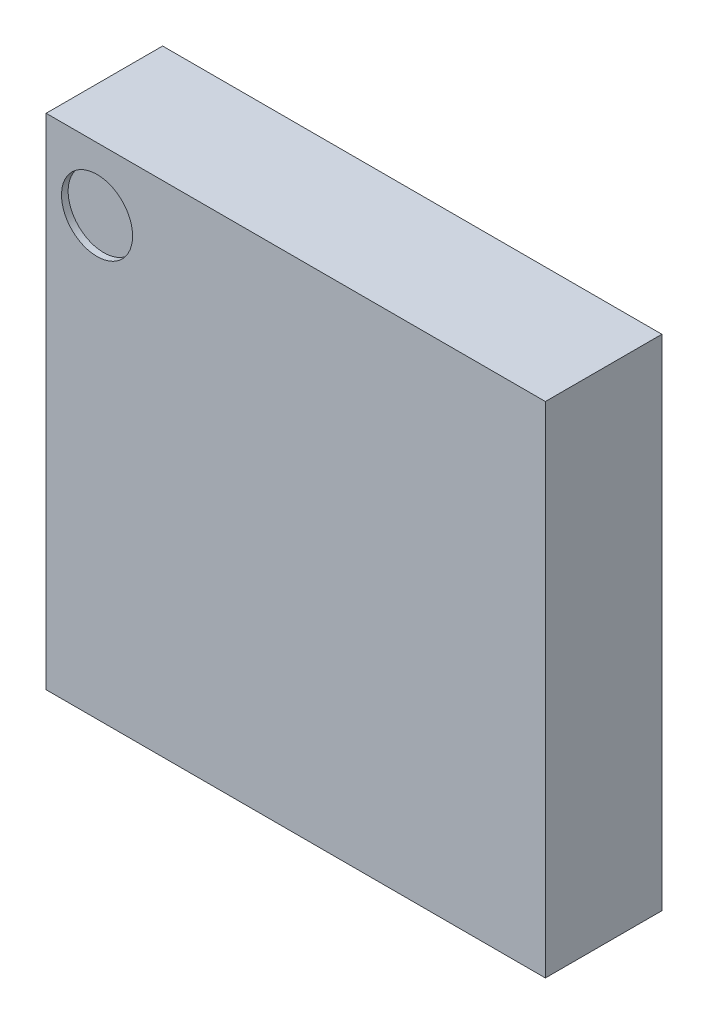
ISO-10303-21;
HEADER;
FILE_DESCRIPTION(('STEP AP214'),'2;1');
FILE_NAME('part.step','',(''),(''),'','','');
FILE_SCHEMA(('AUTOMOTIVE_DESIGN { 1 0 10303 214 1 1 1 1 }'));
ENDSEC;
DATA;
#1=APPLICATION_CONTEXT('core data for automotive mechanical design processes');
#2=APPLICATION_PROTOCOL_DEFINITION('international standard','automotive_design',2000,#1);
#3=PRODUCT_CONTEXT('',#1,'mechanical');
#4=PRODUCT('Part','Part','',(#3));
#5=PRODUCT_RELATED_PRODUCT_CATEGORY('part','',(#4));
#6=PRODUCT_DEFINITION_FORMATION('','',#4);
#7=PRODUCT_DEFINITION_CONTEXT('part definition',#1,'design');
#8=PRODUCT_DEFINITION('design','',#6,#7);
#9=PRODUCT_DEFINITION_SHAPE('','',#8);
#10=(LENGTH_UNIT() NAMED_UNIT(*) SI_UNIT(.MILLI.,.METRE.));
#11=(NAMED_UNIT(*) PLANE_ANGLE_UNIT() SI_UNIT($,.RADIAN.));
#12=(NAMED_UNIT(*) SI_UNIT($,.STERADIAN.) SOLID_ANGLE_UNIT());
#13=UNCERTAINTY_MEASURE_WITH_UNIT(LENGTH_MEASURE(1.E-05),#10,'distance_accuracy_value','');
#14=(GEOMETRIC_REPRESENTATION_CONTEXT(3) GLOBAL_UNCERTAINTY_ASSIGNED_CONTEXT((#13)) GLOBAL_UNIT_ASSIGNED_CONTEXT((#10,
#11,#12)) REPRESENTATION_CONTEXT('',''));
#15=CARTESIAN_POINT('',(0.,0.,0.));
#16=DIRECTION('',(0.,0.,1.));
#17=DIRECTION('',(1.,0.,0.));
#18=AXIS2_PLACEMENT_3D('',#15,#16,#17);
#19=CARTESIAN_POINT('',(-0.75,-0.75,0.45));
#20=DIRECTION('',(0.,1.,0.));
#21=DIRECTION('',(0.,0.,1.));
#22=AXIS2_PLACEMENT_3D('',#19,#20,#21);
#23=PLANE('',#22);
#24=DIRECTION('',(1.,0.,0.));
#25=VECTOR('',#24,1.);
#26=CARTESIAN_POINT('',(-0.75,-0.75,0.1));
#27=LINE('',#26,#25);
#28=CARTESIAN_POINT('',(-0.75,-0.75,0.1));
#29=VERTEX_POINT('',#28);
#30=CARTESIAN_POINT('',(0.749999999999999,-0.75,0.1));
#31=VERTEX_POINT('',#30);
#32=EDGE_CURVE('E110',#29,#31,#27,.T.);
#33=ORIENTED_EDGE('',*,*,#32,.T.);
#34=DIRECTION('',(0.,0.,-1.));
#35=VECTOR('',#34,1.);
#36=CARTESIAN_POINT('',(0.749999999999999,-0.75,0.45));
#37=LINE('',#36,#35);
#38=CARTESIAN_POINT('',(0.749999999999999,-0.75,0.45));
#39=VERTEX_POINT('',#38);
#40=EDGE_CURVE('E11',#39,#31,#37,.T.);
#41=ORIENTED_EDGE('',*,*,#40,.F.);
#42=DIRECTION('',(1.,0.,0.));
#43=VECTOR('',#42,1.);
#44=CARTESIAN_POINT('',(-0.75,-0.75,0.45));
#45=LINE('',#44,#43);
#46=CARTESIAN_POINT('',(-0.75,-0.75,0.45));
#47=VERTEX_POINT('',#46);
#48=EDGE_CURVE('E91',#47,#39,#45,.T.);
#49=ORIENTED_EDGE('',*,*,#48,.F.);
#50=DIRECTION('',(0.,0.,-1.));
#51=VECTOR('',#50,1.);
#52=CARTESIAN_POINT('',(-0.75,-0.75,0.45));
#53=LINE('',#52,#51);
#54=EDGE_CURVE('E58',#47,#29,#53,.T.);
#55=ORIENTED_EDGE('',*,*,#54,.T.);
#56=EDGE_LOOP('',(#33,#41,#49,#55));
#57=FACE_BOUND('',#56,.T.);
#58=ADVANCED_FACE('F39',(#57),#23,.F.);
#59=CARTESIAN_POINT('',(0.749999999999999,-0.75,0.45));
#60=DIRECTION('',(-1.,0.,0.));
#61=DIRECTION('',(0.,0.,1.));
#62=AXIS2_PLACEMENT_3D('',#59,#60,#61);
#63=PLANE('',#62);
#64=DIRECTION('',(0.,1.,0.));
#65=VECTOR('',#64,1.);
#66=CARTESIAN_POINT('',(0.749999999999999,-0.75,0.1));
#67=LINE('',#66,#65);
#68=CARTESIAN_POINT('',(0.749999999999999,0.75,0.1));
#69=VERTEX_POINT('',#68);
#70=EDGE_CURVE('E97',#31,#69,#67,.T.);
#71=ORIENTED_EDGE('',*,*,#70,.T.);
#72=DIRECTION('',(0.,0.,-1.));
#73=VECTOR('',#72,1.);
#74=CARTESIAN_POINT('',(0.749999999999999,0.75,0.45));
#75=LINE('',#74,#73);
#76=CARTESIAN_POINT('',(0.749999999999999,0.75,0.45));
#77=VERTEX_POINT('',#76);
#78=EDGE_CURVE('E49',#77,#69,#75,.T.);
#79=ORIENTED_EDGE('',*,*,#78,.F.);
#80=DIRECTION('',(0.,1.,0.));
#81=VECTOR('',#80,1.);
#82=CARTESIAN_POINT('',(0.749999999999999,-0.75,0.45));
#83=LINE('',#82,#81);
#84=EDGE_CURVE('E83',#39,#77,#83,.T.);
#85=ORIENTED_EDGE('',*,*,#84,.F.);
#86=ORIENTED_EDGE('',*,*,#40,.T.);
#87=EDGE_LOOP('',(#71,#79,#85,#86));
#88=FACE_BOUND('',#87,.T.);
#89=ADVANCED_FACE('F96',(#88),#63,.F.);
#90=CARTESIAN_POINT('',(-0.75,0.75,0.45));
#91=DIRECTION('',(0.,1.,0.));
#92=DIRECTION('',(0.,0.,1.));
#93=AXIS2_PLACEMENT_3D('',#90,#91,#92);
#94=PLANE('',#93);
#95=DIRECTION('',(1.,0.,0.));
#96=VECTOR('',#95,1.);
#97=CARTESIAN_POINT('',(-0.75,0.75,0.1));
#98=LINE('',#97,#96);
#99=CARTESIAN_POINT('',(-0.75,0.75,0.1));
#100=VERTEX_POINT('',#99);
#101=EDGE_CURVE('E116',#100,#69,#98,.T.);
#102=ORIENTED_EDGE('',*,*,#101,.F.);
#103=DIRECTION('',(0.,0.,-1.));
#104=VECTOR('',#103,1.);
#105=CARTESIAN_POINT('',(-0.75,0.75,0.45));
#106=LINE('',#105,#104);
#107=CARTESIAN_POINT('',(-0.75,0.75,0.45));
#108=VERTEX_POINT('',#107);
#109=EDGE_CURVE('E72',#108,#100,#106,.T.);
#110=ORIENTED_EDGE('',*,*,#109,.F.);
#111=DIRECTION('',(1.,0.,0.));
#112=VECTOR('',#111,1.);
#113=CARTESIAN_POINT('',(-0.75,0.75,0.45));
#114=LINE('',#113,#112);
#115=EDGE_CURVE('E90',#108,#77,#114,.T.);
#116=ORIENTED_EDGE('',*,*,#115,.T.);
#117=ORIENTED_EDGE('',*,*,#78,.T.);
#118=EDGE_LOOP('',(#102,#110,#116,#117));
#119=FACE_BOUND('',#118,.T.);
#120=ADVANCED_FACE('F102',(#119),#94,.T.);
#121=CARTESIAN_POINT('',(-0.75,-0.75,0.45));
#122=DIRECTION('',(-1.,0.,0.));
#123=DIRECTION('',(0.,0.,1.));
#124=AXIS2_PLACEMENT_3D('',#121,#122,#123);
#125=PLANE('',#124);
#126=DIRECTION('',(0.,1.,0.));
#127=VECTOR('',#126,1.);
#128=CARTESIAN_POINT('',(-0.75,-0.75,0.1));
#129=LINE('',#128,#127);
#130=EDGE_CURVE('E119',#29,#100,#129,.T.);
#131=ORIENTED_EDGE('',*,*,#130,.F.);
#132=ORIENTED_EDGE('',*,*,#54,.F.);
#133=DIRECTION('',(0.,1.,0.));
#134=VECTOR('',#133,1.);
#135=CARTESIAN_POINT('',(-0.75,-0.75,0.45));
#136=LINE('',#135,#134);
#137=EDGE_CURVE('E104',#47,#108,#136,.T.);
#138=ORIENTED_EDGE('',*,*,#137,.T.);
#139=ORIENTED_EDGE('',*,*,#109,.T.);
#140=EDGE_LOOP('',(#131,#132,#138,#139));
#141=FACE_BOUND('',#140,.T.);
#142=ADVANCED_FACE('F207',(#141),#125,.T.);
#143=CARTESIAN_POINT('',(0.,0.,0.45));
#144=DIRECTION('',(0.,0.,1.));
#145=DIRECTION('',(1.,0.,0.));
#146=AXIS2_PLACEMENT_3D('',#143,#144,#145);
#147=PLANE('',#146);
#148=CARTESIAN_POINT('',(-0.597011529745117,0.560589106885168,0.45));
#149=DIRECTION('',(0.,0.,1.));
#150=DIRECTION('',(1.,0.,0.));
#151=AXIS2_PLACEMENT_3D('',#148,#149,#150);
#152=CIRCLE('',#151,0.106813642751076);
#153=CARTESIAN_POINT('',(-0.490197886994042,0.560589106885168,0.45));
#154=VERTEX_POINT('',#153);
#155=EDGE_CURVE('E193',#154,#154,#152,.T.);
#156=ORIENTED_EDGE('',*,*,#155,.F.);
#157=EDGE_LOOP('',(#156));
#158=FACE_BOUND('',#157,.T.);
#159=ORIENTED_EDGE('',*,*,#48,.T.);
#160=ORIENTED_EDGE('',*,*,#84,.T.);
#161=ORIENTED_EDGE('',*,*,#115,.F.);
#162=ORIENTED_EDGE('',*,*,#137,.F.);
#163=EDGE_LOOP('',(#159,#160,#161,#162));
#164=FACE_BOUND('',#163,.T.);
#165=ADVANCED_FACE('F87',(#158,#164),#147,.T.);
#166=CARTESIAN_POINT('',(0.,0.,0.1));
#167=DIRECTION('',(0.,0.,1.));
#168=DIRECTION('',(1.,0.,0.));
#169=AXIS2_PLACEMENT_3D('',#166,#167,#168);
#170=PLANE('',#169);
#171=CARTESIAN_POINT('',(0.525,0.525,0.1));
#172=DIRECTION('',(0.,0.,1.));
#173=DIRECTION('',(1.,0.,0.));
#174=AXIS2_PLACEMENT_3D('',#171,#172,#173);
#175=CIRCLE('',#174,0.102469507659596);
#176=CARTESIAN_POINT('',(0.627469507659596,0.525,0.1));
#177=VERTEX_POINT('',#176);
#178=EDGE_CURVE('E42',#177,#177,#175,.T.);
#179=ORIENTED_EDGE('',*,*,#178,.T.);
#180=EDGE_LOOP('',(#179));
#181=FACE_BOUND('',#180,.T.);
#182=CARTESIAN_POINT('',(0.525,0.175,0.1));
#183=DIRECTION('',(0.,0.,1.));
#184=DIRECTION('',(1.,0.,0.));
#185=AXIS2_PLACEMENT_3D('',#182,#183,#184);
#186=CIRCLE('',#185,0.102469507659596);
#187=CARTESIAN_POINT('',(0.627469507659596,0.175,0.1));
#188=VERTEX_POINT('',#187);
#189=EDGE_CURVE('E181',#188,#188,#186,.T.);
#190=ORIENTED_EDGE('',*,*,#189,.T.);
#191=EDGE_LOOP('',(#190));
#192=FACE_BOUND('',#191,.T.);
#193=CARTESIAN_POINT('',(0.525,-0.175,0.1));
#194=DIRECTION('',(0.,0.,1.));
#195=DIRECTION('',(1.,0.,0.));
#196=AXIS2_PLACEMENT_3D('',#193,#194,#195);
#197=CIRCLE('',#196,0.102469507659596);
#198=CARTESIAN_POINT('',(0.627469507659596,-0.175,0.1));
#199=VERTEX_POINT('',#198);
#200=EDGE_CURVE('E178',#199,#199,#197,.T.);
#201=ORIENTED_EDGE('',*,*,#200,.T.);
#202=EDGE_LOOP('',(#201));
#203=FACE_BOUND('',#202,.T.);
#204=CARTESIAN_POINT('',(0.525,-0.525,0.1));
#205=DIRECTION('',(0.,0.,1.));
#206=DIRECTION('',(1.,0.,0.));
#207=AXIS2_PLACEMENT_3D('',#204,#205,#206);
#208=CIRCLE('',#207,0.102469507659596);
#209=CARTESIAN_POINT('',(0.627469507659596,-0.525,0.1));
#210=VERTEX_POINT('',#209);
#211=EDGE_CURVE('E174',#210,#210,#208,.T.);
#212=ORIENTED_EDGE('',*,*,#211,.T.);
#213=EDGE_LOOP('',(#212));
#214=FACE_BOUND('',#213,.T.);
#215=CARTESIAN_POINT('',(0.175,0.525,0.1));
#216=DIRECTION('',(0.,0.,1.));
#217=DIRECTION('',(1.,0.,0.));
#218=AXIS2_PLACEMENT_3D('',#215,#216,#217);
#219=CIRCLE('',#218,0.102469507659596);
#220=CARTESIAN_POINT('',(0.277469507659596,0.525,0.1));
#221=VERTEX_POINT('',#220);
#222=EDGE_CURVE('E170',#221,#221,#219,.T.);
#223=ORIENTED_EDGE('',*,*,#222,.T.);
#224=EDGE_LOOP('',(#223));
#225=FACE_BOUND('',#224,.T.);
#226=CARTESIAN_POINT('',(0.175,0.175,0.1));
#227=DIRECTION('',(0.,0.,1.));
#228=DIRECTION('',(1.,0.,0.));
#229=AXIS2_PLACEMENT_3D('',#226,#227,#228);
#230=CIRCLE('',#229,0.102469507659596);
#231=CARTESIAN_POINT('',(0.277469507659596,0.175,0.1));
#232=VERTEX_POINT('',#231);
#233=EDGE_CURVE('E166',#232,#232,#230,.T.);
#234=ORIENTED_EDGE('',*,*,#233,.T.);
#235=EDGE_LOOP('',(#234));
#236=FACE_BOUND('',#235,.T.);
#237=CARTESIAN_POINT('',(0.175,-0.175,0.1));
#238=DIRECTION('',(0.,0.,1.));
#239=DIRECTION('',(1.,0.,0.));
#240=AXIS2_PLACEMENT_3D('',#237,#238,#239);
#241=CIRCLE('',#240,0.102469507659596);
#242=CARTESIAN_POINT('',(0.277469507659596,-0.175,0.1));
#243=VERTEX_POINT('',#242);
#244=EDGE_CURVE('E162',#243,#243,#241,.T.);
#245=ORIENTED_EDGE('',*,*,#244,.T.);
#246=EDGE_LOOP('',(#245));
#247=FACE_BOUND('',#246,.T.);
#248=CARTESIAN_POINT('',(0.175,-0.525,0.1));
#249=DIRECTION('',(0.,0.,1.));
#250=DIRECTION('',(1.,0.,0.));
#251=AXIS2_PLACEMENT_3D('',#248,#249,#250);
#252=CIRCLE('',#251,0.102469507659596);
#253=CARTESIAN_POINT('',(0.277469507659596,-0.525,0.1));
#254=VERTEX_POINT('',#253);
#255=EDGE_CURVE('E158',#254,#254,#252,.T.);
#256=ORIENTED_EDGE('',*,*,#255,.T.);
#257=EDGE_LOOP('',(#256));
#258=FACE_BOUND('',#257,.T.);
#259=CARTESIAN_POINT('',(-0.175,0.525,0.1));
#260=DIRECTION('',(0.,0.,1.));
#261=DIRECTION('',(1.,0.,0.));
#262=AXIS2_PLACEMENT_3D('',#259,#260,#261);
#263=CIRCLE('',#262,0.102469507659596);
#264=CARTESIAN_POINT('',(-0.0725304923404042,0.525,0.1));
#265=VERTEX_POINT('',#264);
#266=EDGE_CURVE('E154',#265,#265,#263,.T.);
#267=ORIENTED_EDGE('',*,*,#266,.T.);
#268=EDGE_LOOP('',(#267));
#269=FACE_BOUND('',#268,.T.);
#270=CARTESIAN_POINT('',(-0.175,0.175,0.1));
#271=DIRECTION('',(0.,0.,1.));
#272=DIRECTION('',(1.,0.,0.));
#273=AXIS2_PLACEMENT_3D('',#270,#271,#272);
#274=CIRCLE('',#273,0.102469507659596);
#275=CARTESIAN_POINT('',(-0.0725304923404042,0.175,0.1));
#276=VERTEX_POINT('',#275);
#277=EDGE_CURVE('E150',#276,#276,#274,.T.);
#278=ORIENTED_EDGE('',*,*,#277,.T.);
#279=EDGE_LOOP('',(#278));
#280=FACE_BOUND('',#279,.T.);
#281=CARTESIAN_POINT('',(-0.175,-0.175,0.1));
#282=DIRECTION('',(0.,0.,1.));
#283=DIRECTION('',(1.,0.,0.));
#284=AXIS2_PLACEMENT_3D('',#281,#282,#283);
#285=CIRCLE('',#284,0.102469507659596);
#286=CARTESIAN_POINT('',(-0.0725304923404042,-0.175,0.1));
#287=VERTEX_POINT('',#286);
#288=EDGE_CURVE('E146',#287,#287,#285,.T.);
#289=ORIENTED_EDGE('',*,*,#288,.T.);
#290=EDGE_LOOP('',(#289));
#291=FACE_BOUND('',#290,.T.);
#292=CARTESIAN_POINT('',(-0.175,-0.525,0.1));
#293=DIRECTION('',(0.,0.,1.));
#294=DIRECTION('',(1.,0.,0.));
#295=AXIS2_PLACEMENT_3D('',#292,#293,#294);
#296=CIRCLE('',#295,0.102469507659596);
#297=CARTESIAN_POINT('',(-0.0725304923404042,-0.525,0.1));
#298=VERTEX_POINT('',#297);
#299=EDGE_CURVE('E142',#298,#298,#296,.T.);
#300=ORIENTED_EDGE('',*,*,#299,.T.);
#301=EDGE_LOOP('',(#300));
#302=FACE_BOUND('',#301,.T.);
#303=CARTESIAN_POINT('',(-0.525,0.525,0.1));
#304=DIRECTION('',(0.,0.,1.));
#305=DIRECTION('',(1.,0.,0.));
#306=AXIS2_PLACEMENT_3D('',#303,#304,#305);
#307=CIRCLE('',#306,0.102469507659596);
#308=CARTESIAN_POINT('',(-0.422530492340404,0.525,0.1));
#309=VERTEX_POINT('',#308);
#310=EDGE_CURVE('E138',#309,#309,#307,.T.);
#311=ORIENTED_EDGE('',*,*,#310,.T.);
#312=EDGE_LOOP('',(#311));
#313=FACE_BOUND('',#312,.T.);
#314=CARTESIAN_POINT('',(-0.525,0.175,0.1));
#315=DIRECTION('',(0.,0.,1.));
#316=DIRECTION('',(1.,0.,0.));
#317=AXIS2_PLACEMENT_3D('',#314,#315,#316);
#318=CIRCLE('',#317,0.102469507659596);
#319=CARTESIAN_POINT('',(-0.422530492340404,0.175,0.1));
#320=VERTEX_POINT('',#319);
#321=EDGE_CURVE('E134',#320,#320,#318,.T.);
#322=ORIENTED_EDGE('',*,*,#321,.T.);
#323=EDGE_LOOP('',(#322));
#324=FACE_BOUND('',#323,.T.);
#325=CARTESIAN_POINT('',(-0.525,-0.175,0.1));
#326=DIRECTION('',(0.,0.,1.));
#327=DIRECTION('',(1.,0.,0.));
#328=AXIS2_PLACEMENT_3D('',#325,#326,#327);
#329=CIRCLE('',#328,0.102469507659596);
#330=CARTESIAN_POINT('',(-0.422530492340404,-0.175,0.1));
#331=VERTEX_POINT('',#330);
#332=EDGE_CURVE('E130',#331,#331,#329,.T.);
#333=ORIENTED_EDGE('',*,*,#332,.T.);
#334=EDGE_LOOP('',(#333));
#335=FACE_BOUND('',#334,.T.);
#336=CARTESIAN_POINT('',(-0.525,-0.525,0.1));
#337=DIRECTION('',(0.,0.,1.));
#338=DIRECTION('',(1.,0.,0.));
#339=AXIS2_PLACEMENT_3D('',#336,#337,#338);
#340=CIRCLE('',#339,0.102469507659596);
#341=CARTESIAN_POINT('',(-0.422530492340404,-0.525,0.1));
#342=VERTEX_POINT('',#341);
#343=EDGE_CURVE('E113',#342,#342,#340,.T.);
#344=ORIENTED_EDGE('',*,*,#343,.T.);
#345=EDGE_LOOP('',(#344));
#346=FACE_BOUND('',#345,.T.);
#347=ORIENTED_EDGE('',*,*,#32,.F.);
#348=ORIENTED_EDGE('',*,*,#130,.T.);
#349=ORIENTED_EDGE('',*,*,#101,.T.);
#350=ORIENTED_EDGE('',*,*,#70,.F.);
#351=EDGE_LOOP('',(#347,#348,#349,#350));
#352=FACE_BOUND('',#351,.T.);
#353=ADVANCED_FACE('F206',(#181,#192,#203,#214,#225,#236,#247,#258,#269,#280,#291,#302,#313,
#324,#335,#346,#352),#170,.F.);
#354=CARTESIAN_POINT('',(-0.525,-0.525,0.06));
#355=DIRECTION('',(0.,0.,1.));
#356=DIRECTION('',(1.,0.,0.));
#357=AXIS2_PLACEMENT_3D('',#354,#355,#356);
#358=SPHERICAL_SURFACE('',#357,0.11);
#359=ORIENTED_EDGE('',*,*,#343,.F.);
#360=EDGE_LOOP('',(#359));
#361=FACE_BOUND('',#360,.T.);
#362=ADVANCED_FACE('F213',(#361),#358,.T.);
#363=CARTESIAN_POINT('',(-0.525,-0.175,0.06));
#364=DIRECTION('',(0.,0.,1.));
#365=DIRECTION('',(1.,0.,0.));
#366=AXIS2_PLACEMENT_3D('',#363,#364,#365);
#367=SPHERICAL_SURFACE('',#366,0.11);
#368=ORIENTED_EDGE('',*,*,#332,.F.);
#369=EDGE_LOOP('',(#368));
#370=FACE_BOUND('',#369,.T.);
#371=ADVANCED_FACE('F242',(#370),#367,.T.);
#372=CARTESIAN_POINT('',(-0.525,0.175,0.06));
#373=DIRECTION('',(0.,0.,1.));
#374=DIRECTION('',(1.,0.,0.));
#375=AXIS2_PLACEMENT_3D('',#372,#373,#374);
#376=SPHERICAL_SURFACE('',#375,0.11);
#377=ORIENTED_EDGE('',*,*,#321,.F.);
#378=EDGE_LOOP('',(#377));
#379=FACE_BOUND('',#378,.T.);
#380=ADVANCED_FACE('F257',(#379),#376,.T.);
#381=CARTESIAN_POINT('',(-0.525,0.525,0.06));
#382=DIRECTION('',(0.,0.,1.));
#383=DIRECTION('',(1.,0.,0.));
#384=AXIS2_PLACEMENT_3D('',#381,#382,#383);
#385=SPHERICAL_SURFACE('',#384,0.11);
#386=ORIENTED_EDGE('',*,*,#310,.F.);
#387=EDGE_LOOP('',(#386));
#388=FACE_BOUND('',#387,.T.);
#389=ADVANCED_FACE('F267',(#388),#385,.T.);
#390=CARTESIAN_POINT('',(-0.175,-0.525,0.06));
#391=DIRECTION('',(0.,0.,1.));
#392=DIRECTION('',(1.,0.,0.));
#393=AXIS2_PLACEMENT_3D('',#390,#391,#392);
#394=SPHERICAL_SURFACE('',#393,0.11);
#395=ORIENTED_EDGE('',*,*,#299,.F.);
#396=EDGE_LOOP('',(#395));
#397=FACE_BOUND('',#396,.T.);
#398=ADVANCED_FACE('F277',(#397),#394,.T.);
#399=CARTESIAN_POINT('',(-0.175,-0.175,0.06));
#400=DIRECTION('',(0.,0.,1.));
#401=DIRECTION('',(1.,0.,0.));
#402=AXIS2_PLACEMENT_3D('',#399,#400,#401);
#403=SPHERICAL_SURFACE('',#402,0.11);
#404=ORIENTED_EDGE('',*,*,#288,.F.);
#405=EDGE_LOOP('',(#404));
#406=FACE_BOUND('',#405,.T.);
#407=ADVANCED_FACE('F287',(#406),#403,.T.);
#408=CARTESIAN_POINT('',(-0.175,0.175,0.06));
#409=DIRECTION('',(0.,0.,1.));
#410=DIRECTION('',(1.,0.,0.));
#411=AXIS2_PLACEMENT_3D('',#408,#409,#410);
#412=SPHERICAL_SURFACE('',#411,0.11);
#413=ORIENTED_EDGE('',*,*,#277,.F.);
#414=EDGE_LOOP('',(#413));
#415=FACE_BOUND('',#414,.T.);
#416=ADVANCED_FACE('F297',(#415),#412,.T.);
#417=CARTESIAN_POINT('',(-0.175,0.525,0.06));
#418=DIRECTION('',(0.,0.,1.));
#419=DIRECTION('',(1.,0.,0.));
#420=AXIS2_PLACEMENT_3D('',#417,#418,#419);
#421=SPHERICAL_SURFACE('',#420,0.11);
#422=ORIENTED_EDGE('',*,*,#266,.F.);
#423=EDGE_LOOP('',(#422));
#424=FACE_BOUND('',#423,.T.);
#425=ADVANCED_FACE('F307',(#424),#421,.T.);
#426=CARTESIAN_POINT('',(0.175,-0.525,0.06));
#427=DIRECTION('',(0.,0.,1.));
#428=DIRECTION('',(1.,0.,0.));
#429=AXIS2_PLACEMENT_3D('',#426,#427,#428);
#430=SPHERICAL_SURFACE('',#429,0.11);
#431=ORIENTED_EDGE('',*,*,#255,.F.);
#432=EDGE_LOOP('',(#431));
#433=FACE_BOUND('',#432,.T.);
#434=ADVANCED_FACE('F317',(#433),#430,.T.);
#435=CARTESIAN_POINT('',(0.175,-0.175,0.06));
#436=DIRECTION('',(0.,0.,1.));
#437=DIRECTION('',(1.,0.,0.));
#438=AXIS2_PLACEMENT_3D('',#435,#436,#437);
#439=SPHERICAL_SURFACE('',#438,0.11);
#440=ORIENTED_EDGE('',*,*,#244,.F.);
#441=EDGE_LOOP('',(#440));
#442=FACE_BOUND('',#441,.T.);
#443=ADVANCED_FACE('F327',(#442),#439,.T.);
#444=CARTESIAN_POINT('',(0.175,0.175,0.06));
#445=DIRECTION('',(0.,0.,1.));
#446=DIRECTION('',(1.,0.,0.));
#447=AXIS2_PLACEMENT_3D('',#444,#445,#446);
#448=SPHERICAL_SURFACE('',#447,0.11);
#449=ORIENTED_EDGE('',*,*,#233,.F.);
#450=EDGE_LOOP('',(#449));
#451=FACE_BOUND('',#450,.T.);
#452=ADVANCED_FACE('F337',(#451),#448,.T.);
#453=CARTESIAN_POINT('',(0.175,0.525,0.06));
#454=DIRECTION('',(0.,0.,1.));
#455=DIRECTION('',(1.,0.,0.));
#456=AXIS2_PLACEMENT_3D('',#453,#454,#455);
#457=SPHERICAL_SURFACE('',#456,0.11);
#458=ORIENTED_EDGE('',*,*,#222,.F.);
#459=EDGE_LOOP('',(#458));
#460=FACE_BOUND('',#459,.T.);
#461=ADVANCED_FACE('F347',(#460),#457,.T.);
#462=CARTESIAN_POINT('',(0.525,-0.525,0.06));
#463=DIRECTION('',(0.,0.,1.));
#464=DIRECTION('',(1.,0.,0.));
#465=AXIS2_PLACEMENT_3D('',#462,#463,#464);
#466=SPHERICAL_SURFACE('',#465,0.11);
#467=ORIENTED_EDGE('',*,*,#211,.F.);
#468=EDGE_LOOP('',(#467));
#469=FACE_BOUND('',#468,.T.);
#470=ADVANCED_FACE('F357',(#469),#466,.T.);
#471=CARTESIAN_POINT('',(0.525,-0.175,0.06));
#472=DIRECTION('',(0.,0.,1.));
#473=DIRECTION('',(1.,0.,0.));
#474=AXIS2_PLACEMENT_3D('',#471,#472,#473);
#475=SPHERICAL_SURFACE('',#474,0.11);
#476=ORIENTED_EDGE('',*,*,#200,.F.);
#477=EDGE_LOOP('',(#476));
#478=FACE_BOUND('',#477,.T.);
#479=ADVANCED_FACE('F367',(#478),#475,.T.);
#480=CARTESIAN_POINT('',(0.525,0.175,0.06));
#481=DIRECTION('',(0.,0.,1.));
#482=DIRECTION('',(1.,0.,0.));
#483=AXIS2_PLACEMENT_3D('',#480,#481,#482);
#484=SPHERICAL_SURFACE('',#483,0.11);
#485=ORIENTED_EDGE('',*,*,#189,.F.);
#486=EDGE_LOOP('',(#485));
#487=FACE_BOUND('',#486,.T.);
#488=ADVANCED_FACE('F377',(#487),#484,.T.);
#489=CARTESIAN_POINT('',(0.525,0.525,0.06));
#490=DIRECTION('',(0.,0.,1.));
#491=DIRECTION('',(1.,0.,0.));
#492=AXIS2_PLACEMENT_3D('',#489,#490,#491);
#493=SPHERICAL_SURFACE('',#492,0.11);
#494=ORIENTED_EDGE('',*,*,#178,.F.);
#495=EDGE_LOOP('',(#494));
#496=FACE_BOUND('',#495,.T.);
#497=ADVANCED_FACE('F387',(#496),#493,.T.);
#498=CARTESIAN_POINT('',(-0.597011529745117,0.560589106885168,0.43));
#499=DIRECTION('',(0.,0.,1.));
#500=DIRECTION('',(1.,0.,0.));
#501=AXIS2_PLACEMENT_3D('',#498,#499,#500);
#502=CYLINDRICAL_SURFACE('',#501,0.106813642751076);
#503=CARTESIAN_POINT('',(-0.597011529745117,0.560589106885168,0.43));
#504=DIRECTION('',(0.,0.,1.));
#505=DIRECTION('',(1.,0.,0.));
#506=AXIS2_PLACEMENT_3D('',#503,#504,#505);
#507=CIRCLE('',#506,0.106813642751076);
#508=CARTESIAN_POINT('',(-0.490197886994042,0.560589106885168,0.43));
#509=VERTEX_POINT('',#508);
#510=EDGE_CURVE('E188',#509,#509,#507,.T.);
#511=ORIENTED_EDGE('',*,*,#510,.F.);
#512=EDGE_LOOP('',(#511));
#513=FACE_BOUND('',#512,.T.);
#514=ORIENTED_EDGE('',*,*,#155,.T.);
#515=EDGE_LOOP('',(#514));
#516=FACE_BOUND('',#515,.T.);
#517=ADVANCED_FACE('F203',(#513,#516),#502,.F.);
#518=CARTESIAN_POINT('',(-0.597011529745117,0.560589106885168,0.43));
#519=DIRECTION('',(0.,0.,1.));
#520=DIRECTION('',(1.,0.,0.));
#521=AXIS2_PLACEMENT_3D('',#518,#519,#520);
#522=PLANE('',#521);
#523=ORIENTED_EDGE('',*,*,#510,.T.);
#524=EDGE_LOOP('',(#523));
#525=FACE_BOUND('',#524,.T.);
#526=ADVANCED_FACE('F409',(#525),#522,.T.);
#527=CLOSED_SHELL('',(#58,#89,#120,#142,#165,#353,#362,#371,#380,#389,#398,#407,#416,#425,#434,
#443,#452,#461,#470,#479,#488,#497,#517,#526));
#528=MANIFOLD_SOLID_BREP('B2',#527);
#529=ADVANCED_BREP_SHAPE_REPRESENTATION('',(#18,#528),#14);
#530=SHAPE_DEFINITION_REPRESENTATION(#9,#529);
ENDSEC;
END-ISO-10303-21;
